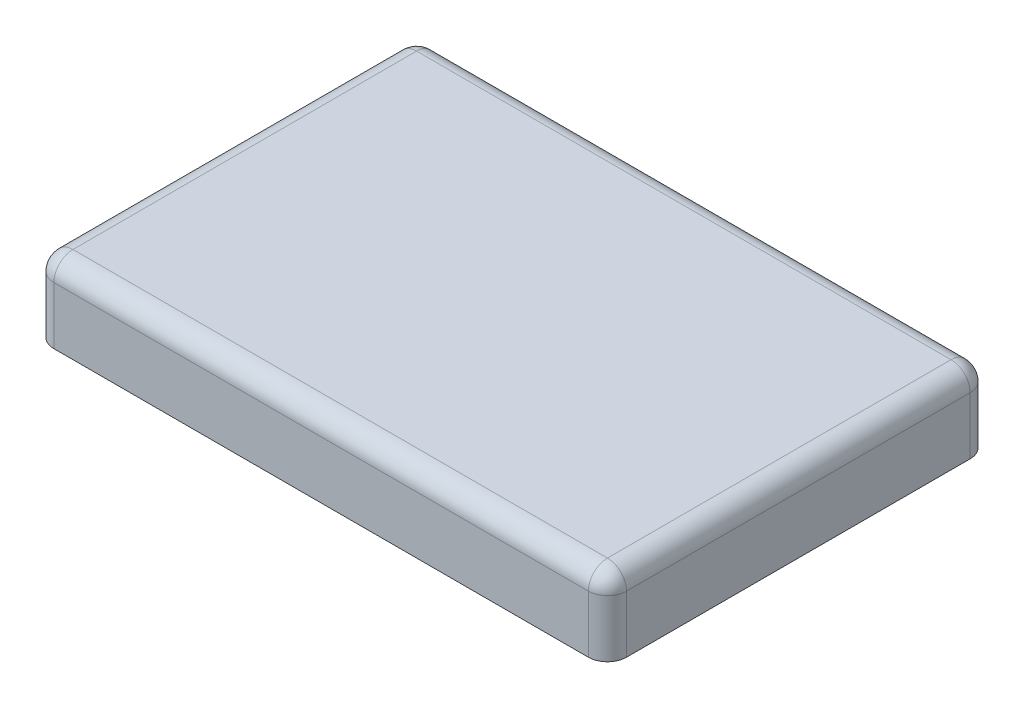
ISO-10303-21;
HEADER;
FILE_DESCRIPTION(('STEP AP214'),'2;1');
FILE_NAME('part.step','',(''),(''),'','','');
FILE_SCHEMA(('AUTOMOTIVE_DESIGN { 1 0 10303 214 1 1 1 1 }'));
ENDSEC;
DATA;
#1=APPLICATION_CONTEXT('core data for automotive mechanical design processes');
#2=APPLICATION_PROTOCOL_DEFINITION('international standard','automotive_design',2000,#1);
#3=PRODUCT_CONTEXT('',#1,'mechanical');
#4=PRODUCT('Part','Part','',(#3));
#5=PRODUCT_RELATED_PRODUCT_CATEGORY('part','',(#4));
#6=PRODUCT_DEFINITION_FORMATION('','',#4);
#7=PRODUCT_DEFINITION_CONTEXT('part definition',#1,'design');
#8=PRODUCT_DEFINITION('design','',#6,#7);
#9=PRODUCT_DEFINITION_SHAPE('','',#8);
#10=(LENGTH_UNIT() NAMED_UNIT(*) SI_UNIT(.MILLI.,.METRE.));
#11=(NAMED_UNIT(*) PLANE_ANGLE_UNIT() SI_UNIT($,.RADIAN.));
#12=(NAMED_UNIT(*) SI_UNIT($,.STERADIAN.) SOLID_ANGLE_UNIT());
#13=UNCERTAINTY_MEASURE_WITH_UNIT(LENGTH_MEASURE(1.E-05),#10,'distance_accuracy_value','');
#14=(GEOMETRIC_REPRESENTATION_CONTEXT(3) GLOBAL_UNCERTAINTY_ASSIGNED_CONTEXT((#13)) GLOBAL_UNIT_ASSIGNED_CONTEXT((#10,
#11,#12)) REPRESENTATION_CONTEXT('',''));
#15=CARTESIAN_POINT('',(0.,0.,0.));
#16=DIRECTION('',(0.,0.,1.));
#17=DIRECTION('',(1.,0.,0.));
#18=AXIS2_PLACEMENT_3D('',#15,#16,#17);
#19=CARTESIAN_POINT('',(0.,0.,0.));
#20=DIRECTION('',(0.,-1.,0.));
#21=DIRECTION('',(0.,0.,-1.));
#22=AXIS2_PLACEMENT_3D('',#19,#20,#21);
#23=PLANE('',#22);
#24=DIRECTION('',(0.,0.,1.));
#25=VECTOR('',#24,1.);
#26=CARTESIAN_POINT('',(-95.25,0.,63.5));
#27=LINE('',#26,#25);
#28=CARTESIAN_POINT('',(-95.25,0.,-57.15));
#29=VERTEX_POINT('',#28);
#30=CARTESIAN_POINT('',(-95.25,0.,57.15));
#31=VERTEX_POINT('',#30);
#32=EDGE_CURVE('E285',#29,#31,#27,.T.);
#33=ORIENTED_EDGE('',*,*,#32,.F.);
#34=CARTESIAN_POINT('',(-88.9,0.,-57.15));
#35=DIRECTION('',(0.,-1.,0.));
#36=DIRECTION('',(0.,0.,-1.));
#37=AXIS2_PLACEMENT_3D('',#34,#35,#36);
#38=CIRCLE('',#37,6.35);
#39=CARTESIAN_POINT('',(-88.9,0.,-63.5));
#40=VERTEX_POINT('',#39);
#41=EDGE_CURVE('E11',#29,#40,#38,.T.);
#42=ORIENTED_EDGE('',*,*,#41,.T.);
#43=DIRECTION('',(-1.,0.,0.));
#44=VECTOR('',#43,1.);
#45=CARTESIAN_POINT('',(-95.25,0.,-63.5));
#46=LINE('',#45,#44);
#47=CARTESIAN_POINT('',(88.9,0.,-63.5));
#48=VERTEX_POINT('',#47);
#49=EDGE_CURVE('E282',#48,#40,#46,.T.);
#50=ORIENTED_EDGE('',*,*,#49,.F.);
#51=CARTESIAN_POINT('',(88.9,0.,-57.15));
#52=DIRECTION('',(0.,-1.,0.));
#53=DIRECTION('',(0.,0.,-1.));
#54=AXIS2_PLACEMENT_3D('',#51,#52,#53);
#55=CIRCLE('',#54,6.35);
#56=CARTESIAN_POINT('',(95.25,0.,-57.15));
#57=VERTEX_POINT('',#56);
#58=EDGE_CURVE('E44',#48,#57,#55,.T.);
#59=ORIENTED_EDGE('',*,*,#58,.T.);
#60=DIRECTION('',(0.,0.,-1.));
#61=VECTOR('',#60,1.);
#62=CARTESIAN_POINT('',(95.25,0.,63.5));
#63=LINE('',#62,#61);
#64=CARTESIAN_POINT('',(95.25,0.,57.15));
#65=VERTEX_POINT('',#64);
#66=EDGE_CURVE('E280',#65,#57,#63,.T.);
#67=ORIENTED_EDGE('',*,*,#66,.F.);
#68=CARTESIAN_POINT('',(88.9,0.,57.15));
#69=DIRECTION('',(0.,-1.,0.));
#70=DIRECTION('',(0.,0.,-1.));
#71=AXIS2_PLACEMENT_3D('',#68,#69,#70);
#72=CIRCLE('',#71,6.35);
#73=CARTESIAN_POINT('',(88.9,0.,63.5));
#74=VERTEX_POINT('',#73);
#75=EDGE_CURVE('E324',#65,#74,#72,.T.);
#76=ORIENTED_EDGE('',*,*,#75,.T.);
#77=DIRECTION('',(1.,0.,0.));
#78=VECTOR('',#77,1.);
#79=CARTESIAN_POINT('',(-95.25,0.,63.5));
#80=LINE('',#79,#78);
#81=CARTESIAN_POINT('',(-88.9,0.,63.5));
#82=VERTEX_POINT('',#81);
#83=EDGE_CURVE('E288',#82,#74,#80,.T.);
#84=ORIENTED_EDGE('',*,*,#83,.F.);
#85=CARTESIAN_POINT('',(-88.9,0.,57.15));
#86=DIRECTION('',(0.,-1.,0.));
#87=DIRECTION('',(0.,0.,-1.));
#88=AXIS2_PLACEMENT_3D('',#85,#86,#87);
#89=CIRCLE('',#88,6.35);
#90=EDGE_CURVE('E326',#82,#31,#89,.T.);
#91=ORIENTED_EDGE('',*,*,#90,.T.);
#92=EDGE_LOOP('',(#33,#42,#50,#59,#67,#76,#84,#91));
#93=FACE_BOUND('',#92,.T.);
#94=CARTESIAN_POINT('',(-88.9,0.,-57.15));
#95=DIRECTION('',(0.,-1.,0.));
#96=DIRECTION('',(0.,0.,-1.));
#97=AXIS2_PLACEMENT_3D('',#94,#95,#96);
#98=CIRCLE('',#97,3.81);
#99=CARTESIAN_POINT('',(-92.71,0.,-57.15));
#100=VERTEX_POINT('',#99);
#101=CARTESIAN_POINT('',(-88.9,0.,-60.96));
#102=VERTEX_POINT('',#101);
#103=EDGE_CURVE('E274',#100,#102,#98,.T.);
#104=ORIENTED_EDGE('',*,*,#103,.F.);
#105=DIRECTION('',(0.,0.,1.));
#106=VECTOR('',#105,1.);
#107=CARTESIAN_POINT('',(-92.71,0.,0.));
#108=LINE('',#107,#106);
#109=CARTESIAN_POINT('',(-92.71,0.,57.15));
#110=VERTEX_POINT('',#109);
#111=EDGE_CURVE('E270',#100,#110,#108,.T.);
#112=ORIENTED_EDGE('',*,*,#111,.T.);
#113=CARTESIAN_POINT('',(-88.9,0.,57.15));
#114=DIRECTION('',(0.,-1.,0.));
#115=DIRECTION('',(0.,0.,-1.));
#116=AXIS2_PLACEMENT_3D('',#113,#114,#115);
#117=CIRCLE('',#116,3.81);
#118=CARTESIAN_POINT('',(-88.9,0.,60.96));
#119=VERTEX_POINT('',#118);
#120=EDGE_CURVE('E268',#119,#110,#117,.T.);
#121=ORIENTED_EDGE('',*,*,#120,.F.);
#122=DIRECTION('',(1.,0.,0.));
#123=VECTOR('',#122,1.);
#124=CARTESIAN_POINT('',(0.,0.,60.96));
#125=LINE('',#124,#123);
#126=CARTESIAN_POINT('',(88.9,0.,60.96));
#127=VERTEX_POINT('',#126);
#128=EDGE_CURVE('E52',#119,#127,#125,.T.);
#129=ORIENTED_EDGE('',*,*,#128,.T.);
#130=CARTESIAN_POINT('',(88.9,0.,57.15));
#131=DIRECTION('',(0.,-1.,0.));
#132=DIRECTION('',(0.,0.,-1.));
#133=AXIS2_PLACEMENT_3D('',#130,#131,#132);
#134=CIRCLE('',#133,3.81);
#135=CARTESIAN_POINT('',(92.71,0.,57.15));
#136=VERTEX_POINT('',#135);
#137=EDGE_CURVE('E186',#136,#127,#134,.T.);
#138=ORIENTED_EDGE('',*,*,#137,.F.);
#139=DIRECTION('',(0.,0.,-1.));
#140=VECTOR('',#139,1.);
#141=CARTESIAN_POINT('',(92.71,0.,0.));
#142=LINE('',#141,#140);
#143=CARTESIAN_POINT('',(92.71,0.,-57.15));
#144=VERTEX_POINT('',#143);
#145=EDGE_CURVE('E226',#136,#144,#142,.T.);
#146=ORIENTED_EDGE('',*,*,#145,.T.);
#147=CARTESIAN_POINT('',(88.9,0.,-57.15));
#148=DIRECTION('',(0.,-1.,0.));
#149=DIRECTION('',(0.,0.,-1.));
#150=AXIS2_PLACEMENT_3D('',#147,#148,#149);
#151=CIRCLE('',#150,3.81);
#152=CARTESIAN_POINT('',(88.9,0.,-60.96));
#153=VERTEX_POINT('',#152);
#154=EDGE_CURVE('E181',#153,#144,#151,.T.);
#155=ORIENTED_EDGE('',*,*,#154,.F.);
#156=DIRECTION('',(-1.,0.,0.));
#157=VECTOR('',#156,1.);
#158=CARTESIAN_POINT('',(0.,0.,-60.96));
#159=LINE('',#158,#157);
#160=EDGE_CURVE('E266',#153,#102,#159,.T.);
#161=ORIENTED_EDGE('',*,*,#160,.T.);
#162=EDGE_LOOP('',(#104,#112,#121,#129,#138,#146,#155,#161));
#163=FACE_BOUND('',#162,.T.);
#164=ADVANCED_FACE('F35',(#93,#163),#23,.T.);
#165=CARTESIAN_POINT('',(95.25,25.4,63.5));
#166=DIRECTION('',(-1.,0.,0.));
#167=DIRECTION('',(0.,0.,1.));
#168=AXIS2_PLACEMENT_3D('',#165,#166,#167);
#169=PLANE('',#168);
#170=ORIENTED_EDGE('',*,*,#66,.T.);
#171=DIRECTION('',(0.,-1.,0.));
#172=VECTOR('',#171,1.);
#173=CARTESIAN_POINT('',(95.25,25.4,-57.15));
#174=LINE('',#173,#172);
#175=CARTESIAN_POINT('',(95.25,19.05,-57.15));
#176=VERTEX_POINT('',#175);
#177=EDGE_CURVE('E60',#57,#176,#174,.F.);
#178=ORIENTED_EDGE('',*,*,#177,.T.);
#179=DIRECTION('',(0.,0.,-1.));
#180=VECTOR('',#179,1.);
#181=CARTESIAN_POINT('',(95.25,19.05,63.5));
#182=LINE('',#181,#180);
#183=CARTESIAN_POINT('',(95.25,19.05,57.15));
#184=VERTEX_POINT('',#183);
#185=EDGE_CURVE('E321',#176,#184,#182,.F.);
#186=ORIENTED_EDGE('',*,*,#185,.T.);
#187=DIRECTION('',(0.,-1.,0.));
#188=VECTOR('',#187,1.);
#189=CARTESIAN_POINT('',(95.25,25.4,57.15));
#190=LINE('',#189,#188);
#191=EDGE_CURVE('E319',#184,#65,#190,.T.);
#192=ORIENTED_EDGE('',*,*,#191,.T.);
#193=EDGE_LOOP('',(#170,#178,#186,#192));
#194=FACE_BOUND('',#193,.T.);
#195=ADVANCED_FACE('F395',(#194),#169,.F.);
#196=CARTESIAN_POINT('',(-95.25,25.4,-63.5));
#197=DIRECTION('',(0.,0.,1.));
#198=DIRECTION('',(1.,0.,0.));
#199=AXIS2_PLACEMENT_3D('',#196,#197,#198);
#200=PLANE('',#199);
#201=ORIENTED_EDGE('',*,*,#49,.T.);
#202=DIRECTION('',(0.,-1.,0.));
#203=VECTOR('',#202,1.);
#204=CARTESIAN_POINT('',(-88.9,25.4,-63.5));
#205=LINE('',#204,#203);
#206=CARTESIAN_POINT('',(-88.9,19.05,-63.5));
#207=VERTEX_POINT('',#206);
#208=EDGE_CURVE('E317',#40,#207,#205,.F.);
#209=ORIENTED_EDGE('',*,*,#208,.T.);
#210=DIRECTION('',(-1.,0.,0.));
#211=VECTOR('',#210,1.);
#212=CARTESIAN_POINT('',(-95.25,19.05,-63.5));
#213=LINE('',#212,#211);
#214=CARTESIAN_POINT('',(88.9,19.05,-63.5));
#215=VERTEX_POINT('',#214);
#216=EDGE_CURVE('E315',#207,#215,#213,.F.);
#217=ORIENTED_EDGE('',*,*,#216,.T.);
#218=DIRECTION('',(0.,-1.,0.));
#219=VECTOR('',#218,1.);
#220=CARTESIAN_POINT('',(88.9,25.4,-63.5));
#221=LINE('',#220,#219);
#222=EDGE_CURVE('E313',#215,#48,#221,.T.);
#223=ORIENTED_EDGE('',*,*,#222,.T.);
#224=EDGE_LOOP('',(#201,#209,#217,#223));
#225=FACE_BOUND('',#224,.T.);
#226=ADVANCED_FACE('F384',(#225),#200,.F.);
#227=CARTESIAN_POINT('',(-95.25,25.4,63.5));
#228=DIRECTION('',(1.,0.,0.));
#229=DIRECTION('',(0.,0.,-1.));
#230=AXIS2_PLACEMENT_3D('',#227,#228,#229);
#231=PLANE('',#230);
#232=DIRECTION('',(0.,0.,1.));
#233=VECTOR('',#232,1.);
#234=CARTESIAN_POINT('',(-95.25,19.05,63.5));
#235=LINE('',#234,#233);
#236=CARTESIAN_POINT('',(-95.25,19.05,57.15));
#237=VERTEX_POINT('',#236);
#238=CARTESIAN_POINT('',(-95.25,19.05,-57.15));
#239=VERTEX_POINT('',#238);
#240=EDGE_CURVE('E309',#237,#239,#235,.F.);
#241=ORIENTED_EDGE('',*,*,#240,.T.);
#242=DIRECTION('',(0.,-1.,0.));
#243=VECTOR('',#242,1.);
#244=CARTESIAN_POINT('',(-95.25,25.4,-57.15));
#245=LINE('',#244,#243);
#246=EDGE_CURVE('E311',#239,#29,#245,.T.);
#247=ORIENTED_EDGE('',*,*,#246,.T.);
#248=ORIENTED_EDGE('',*,*,#32,.T.);
#249=DIRECTION('',(0.,-1.,0.));
#250=VECTOR('',#249,1.);
#251=CARTESIAN_POINT('',(-95.25,25.4,57.15));
#252=LINE('',#251,#250);
#253=EDGE_CURVE('E307',#31,#237,#252,.F.);
#254=ORIENTED_EDGE('',*,*,#253,.T.);
#255=EDGE_LOOP('',(#241,#247,#248,#254));
#256=FACE_BOUND('',#255,.T.);
#257=ADVANCED_FACE('F420',(#256),#231,.F.);
#258=CARTESIAN_POINT('',(-95.25,25.4,63.5));
#259=DIRECTION('',(0.,0.,-1.));
#260=DIRECTION('',(-1.,0.,0.));
#261=AXIS2_PLACEMENT_3D('',#258,#259,#260);
#262=PLANE('',#261);
#263=DIRECTION('',(1.,0.,0.));
#264=VECTOR('',#263,1.);
#265=CARTESIAN_POINT('',(-95.25,19.05,63.5));
#266=LINE('',#265,#264);
#267=CARTESIAN_POINT('',(88.9,19.05,63.5));
#268=VERTEX_POINT('',#267);
#269=CARTESIAN_POINT('',(-88.9,19.05,63.5));
#270=VERTEX_POINT('',#269);
#271=EDGE_CURVE('E302',#268,#270,#266,.F.);
#272=ORIENTED_EDGE('',*,*,#271,.T.);
#273=DIRECTION('',(0.,-1.,0.));
#274=VECTOR('',#273,1.);
#275=CARTESIAN_POINT('',(-88.9,25.4,63.5));
#276=LINE('',#275,#274);
#277=EDGE_CURVE('E305',#270,#82,#276,.T.);
#278=ORIENTED_EDGE('',*,*,#277,.T.);
#279=ORIENTED_EDGE('',*,*,#83,.T.);
#280=DIRECTION('',(0.,-1.,0.));
#281=VECTOR('',#280,1.);
#282=CARTESIAN_POINT('',(88.9,25.4,63.5));
#283=LINE('',#282,#281);
#284=EDGE_CURVE('E300',#74,#268,#283,.F.);
#285=ORIENTED_EDGE('',*,*,#284,.T.);
#286=EDGE_LOOP('',(#272,#278,#279,#285));
#287=FACE_BOUND('',#286,.T.);
#288=ADVANCED_FACE('F412',(#287),#262,.F.);
#289=CARTESIAN_POINT('',(0.,25.4,0.));
#290=DIRECTION('',(0.,-1.,0.));
#291=DIRECTION('',(0.,0.,-1.));
#292=AXIS2_PLACEMENT_3D('',#289,#290,#291);
#293=PLANE('',#292);
#294=DIRECTION('',(0.,0.,1.));
#295=VECTOR('',#294,1.);
#296=CARTESIAN_POINT('',(-88.9,25.4,0.));
#297=LINE('',#296,#295);
#298=CARTESIAN_POINT('',(-88.9,25.4,-57.15));
#299=VERTEX_POINT('',#298);
#300=CARTESIAN_POINT('',(-88.9,25.4,57.15));
#301=VERTEX_POINT('',#300);
#302=EDGE_CURVE('E295',#299,#301,#297,.T.);
#303=ORIENTED_EDGE('',*,*,#302,.T.);
#304=DIRECTION('',(1.,0.,0.));
#305=VECTOR('',#304,1.);
#306=CARTESIAN_POINT('',(0.,25.4,57.15));
#307=LINE('',#306,#305);
#308=CARTESIAN_POINT('',(88.9,25.4,57.15));
#309=VERTEX_POINT('',#308);
#310=EDGE_CURVE('E297',#301,#309,#307,.T.);
#311=ORIENTED_EDGE('',*,*,#310,.T.);
#312=DIRECTION('',(0.,0.,-1.));
#313=VECTOR('',#312,1.);
#314=CARTESIAN_POINT('',(88.9,25.4,0.));
#315=LINE('',#314,#313);
#316=CARTESIAN_POINT('',(88.9,25.4,-57.15));
#317=VERTEX_POINT('',#316);
#318=EDGE_CURVE('E291',#309,#317,#315,.T.);
#319=ORIENTED_EDGE('',*,*,#318,.T.);
#320=DIRECTION('',(-1.,0.,0.));
#321=VECTOR('',#320,1.);
#322=CARTESIAN_POINT('',(0.,25.4,-57.15));
#323=LINE('',#322,#321);
#324=EDGE_CURVE('E293',#317,#299,#323,.T.);
#325=ORIENTED_EDGE('',*,*,#324,.T.);
#326=EDGE_LOOP('',(#303,#311,#319,#325));
#327=FACE_BOUND('',#326,.T.);
#328=ADVANCED_FACE('F374',(#327),#293,.F.);
#329=CARTESIAN_POINT('',(-88.9,25.4,-57.15));
#330=DIRECTION('',(0.,-1.,0.));
#331=DIRECTION('',(0.,0.,-1.));
#332=AXIS2_PLACEMENT_3D('',#329,#330,#331);
#333=CYLINDRICAL_SURFACE('',#332,6.35);
#334=ORIENTED_EDGE('',*,*,#41,.F.);
#335=ORIENTED_EDGE('',*,*,#246,.F.);
#336=CARTESIAN_POINT('',(-88.9,19.05,-57.15));
#337=DIRECTION('',(0.,1.,0.));
#338=DIRECTION('',(0.,0.,1.));
#339=AXIS2_PLACEMENT_3D('',#336,#337,#338);
#340=CIRCLE('',#339,6.35);
#341=EDGE_CURVE('E39',#207,#239,#340,.T.);
#342=ORIENTED_EDGE('',*,*,#341,.F.);
#343=ORIENTED_EDGE('',*,*,#208,.F.);
#344=EDGE_LOOP('',(#334,#335,#342,#343));
#345=FACE_BOUND('',#344,.T.);
#346=ADVANCED_FACE('F37',(#345),#333,.T.);
#347=CARTESIAN_POINT('',(0.,19.05,-57.15));
#348=DIRECTION('',(-1.,0.,0.));
#349=DIRECTION('',(0.,0.,1.));
#350=AXIS2_PLACEMENT_3D('',#347,#348,#349);
#351=CYLINDRICAL_SURFACE('',#350,6.35);
#352=CARTESIAN_POINT('',(88.9,19.05,-57.15));
#353=DIRECTION('',(1.,0.,0.));
#354=DIRECTION('',(0.,0.,-1.));
#355=AXIS2_PLACEMENT_3D('',#352,#353,#354);
#356=CIRCLE('',#355,6.35);
#357=EDGE_CURVE('E353',#215,#317,#356,.T.);
#358=ORIENTED_EDGE('',*,*,#357,.F.);
#359=ORIENTED_EDGE('',*,*,#216,.F.);
#360=CARTESIAN_POINT('',(-88.9,19.05,-57.15));
#361=DIRECTION('',(-1.,0.,0.));
#362=DIRECTION('',(0.,0.,1.));
#363=AXIS2_PLACEMENT_3D('',#360,#361,#362);
#364=CIRCLE('',#363,6.35);
#365=EDGE_CURVE('E355',#299,#207,#364,.T.);
#366=ORIENTED_EDGE('',*,*,#365,.F.);
#367=ORIENTED_EDGE('',*,*,#324,.F.);
#368=EDGE_LOOP('',(#358,#359,#366,#367));
#369=FACE_BOUND('',#368,.T.);
#370=ADVANCED_FACE('F381',(#369),#351,.T.);
#371=CARTESIAN_POINT('',(88.9,25.4,-57.15));
#372=DIRECTION('',(0.,-1.,0.));
#373=DIRECTION('',(0.,0.,-1.));
#374=AXIS2_PLACEMENT_3D('',#371,#372,#373);
#375=CYLINDRICAL_SURFACE('',#374,6.35);
#376=ORIENTED_EDGE('',*,*,#58,.F.);
#377=ORIENTED_EDGE('',*,*,#222,.F.);
#378=CARTESIAN_POINT('',(88.9,19.05,-57.15));
#379=DIRECTION('',(0.,1.,0.));
#380=DIRECTION('',(0.,0.,1.));
#381=AXIS2_PLACEMENT_3D('',#378,#379,#380);
#382=CIRCLE('',#381,6.35);
#383=EDGE_CURVE('E350',#176,#215,#382,.T.);
#384=ORIENTED_EDGE('',*,*,#383,.F.);
#385=ORIENTED_EDGE('',*,*,#177,.F.);
#386=EDGE_LOOP('',(#376,#377,#384,#385));
#387=FACE_BOUND('',#386,.T.);
#388=ADVANCED_FACE('F388',(#387),#375,.T.);
#389=CARTESIAN_POINT('',(-88.9,19.05,-57.15));
#390=DIRECTION('',(0.,0.,1.));
#391=DIRECTION('',(1.,0.,0.));
#392=AXIS2_PLACEMENT_3D('',#389,#390,#391);
#393=SPHERICAL_SURFACE('',#392,6.35);
#394=ORIENTED_EDGE('',*,*,#365,.T.);
#395=ORIENTED_EDGE('',*,*,#341,.T.);
#396=CARTESIAN_POINT('',(-88.9,19.05,-57.15));
#397=DIRECTION('',(0.,0.,-1.));
#398=DIRECTION('',(0.,1.,0.));
#399=AXIS2_PLACEMENT_3D('',#396,#397,#398);
#400=CIRCLE('',#399,6.35);
#401=EDGE_CURVE('E347',#299,#239,#400,.F.);
#402=ORIENTED_EDGE('',*,*,#401,.F.);
#403=EDGE_LOOP('',(#394,#395,#402));
#404=FACE_BOUND('',#403,.T.);
#405=ADVANCED_FACE('F362',(#404),#393,.T.);
#406=CARTESIAN_POINT('',(88.9,19.05,-57.15));
#407=DIRECTION('',(0.,0.,1.));
#408=DIRECTION('',(1.,0.,0.));
#409=AXIS2_PLACEMENT_3D('',#406,#407,#408);
#410=SPHERICAL_SURFACE('',#409,6.35);
#411=ORIENTED_EDGE('',*,*,#383,.T.);
#412=ORIENTED_EDGE('',*,*,#357,.T.);
#413=CARTESIAN_POINT('',(88.9,19.05,-57.15));
#414=DIRECTION('',(0.,0.,-1.));
#415=DIRECTION('',(-1.,0.,0.));
#416=AXIS2_PLACEMENT_3D('',#413,#414,#415);
#417=CIRCLE('',#416,6.35);
#418=EDGE_CURVE('E344',#176,#317,#417,.F.);
#419=ORIENTED_EDGE('',*,*,#418,.F.);
#420=EDGE_LOOP('',(#411,#412,#419));
#421=FACE_BOUND('',#420,.T.);
#422=ADVANCED_FACE('F458',(#421),#410,.T.);
#423=CARTESIAN_POINT('',(-88.9,25.4,57.15));
#424=DIRECTION('',(0.,-1.,0.));
#425=DIRECTION('',(0.,0.,-1.));
#426=AXIS2_PLACEMENT_3D('',#423,#424,#425);
#427=CYLINDRICAL_SURFACE('',#426,6.35);
#428=ORIENTED_EDGE('',*,*,#90,.F.);
#429=ORIENTED_EDGE('',*,*,#277,.F.);
#430=CARTESIAN_POINT('',(-88.9,19.05,57.15));
#431=DIRECTION('',(0.,1.,0.));
#432=DIRECTION('',(0.,0.,1.));
#433=AXIS2_PLACEMENT_3D('',#430,#431,#432);
#434=CIRCLE('',#433,6.35);
#435=EDGE_CURVE('E341',#237,#270,#434,.T.);
#436=ORIENTED_EDGE('',*,*,#435,.F.);
#437=ORIENTED_EDGE('',*,*,#253,.F.);
#438=EDGE_LOOP('',(#428,#429,#436,#437));
#439=FACE_BOUND('',#438,.T.);
#440=ADVANCED_FACE('F418',(#439),#427,.T.);
#441=CARTESIAN_POINT('',(-88.9,19.05,0.));
#442=DIRECTION('',(0.,0.,1.));
#443=DIRECTION('',(1.,0.,0.));
#444=AXIS2_PLACEMENT_3D('',#441,#442,#443);
#445=CYLINDRICAL_SURFACE('',#444,6.35);
#446=ORIENTED_EDGE('',*,*,#401,.T.);
#447=ORIENTED_EDGE('',*,*,#240,.F.);
#448=CARTESIAN_POINT('',(-88.9,19.05,57.15));
#449=DIRECTION('',(0.,0.,1.));
#450=DIRECTION('',(1.,0.,0.));
#451=AXIS2_PLACEMENT_3D('',#448,#449,#450);
#452=CIRCLE('',#451,6.35);
#453=EDGE_CURVE('E338',#301,#237,#452,.T.);
#454=ORIENTED_EDGE('',*,*,#453,.F.);
#455=ORIENTED_EDGE('',*,*,#302,.F.);
#456=EDGE_LOOP('',(#446,#447,#454,#455));
#457=FACE_BOUND('',#456,.T.);
#458=ADVANCED_FACE('F369',(#457),#445,.T.);
#459=CARTESIAN_POINT('',(88.9,19.05,0.));
#460=DIRECTION('',(0.,0.,-1.));
#461=DIRECTION('',(-1.,0.,0.));
#462=AXIS2_PLACEMENT_3D('',#459,#460,#461);
#463=CYLINDRICAL_SURFACE('',#462,6.35);
#464=ORIENTED_EDGE('',*,*,#418,.T.);
#465=ORIENTED_EDGE('',*,*,#318,.F.);
#466=CARTESIAN_POINT('',(88.9,19.05,57.15));
#467=DIRECTION('',(0.,0.,1.));
#468=DIRECTION('',(1.,0.,0.));
#469=AXIS2_PLACEMENT_3D('',#466,#467,#468);
#470=CIRCLE('',#469,6.35);
#471=EDGE_CURVE('E335',#184,#309,#470,.T.);
#472=ORIENTED_EDGE('',*,*,#471,.F.);
#473=ORIENTED_EDGE('',*,*,#185,.F.);
#474=EDGE_LOOP('',(#464,#465,#472,#473));
#475=FACE_BOUND('',#474,.T.);
#476=ADVANCED_FACE('F405',(#475),#463,.T.);
#477=CARTESIAN_POINT('',(88.9,25.4,57.15));
#478=DIRECTION('',(0.,-1.,0.));
#479=DIRECTION('',(0.,0.,-1.));
#480=AXIS2_PLACEMENT_3D('',#477,#478,#479);
#481=CYLINDRICAL_SURFACE('',#480,6.35);
#482=ORIENTED_EDGE('',*,*,#75,.F.);
#483=ORIENTED_EDGE('',*,*,#191,.F.);
#484=CARTESIAN_POINT('',(88.9,19.05,57.15));
#485=DIRECTION('',(0.,1.,0.));
#486=DIRECTION('',(0.,0.,1.));
#487=AXIS2_PLACEMENT_3D('',#484,#485,#486);
#488=CIRCLE('',#487,6.35);
#489=EDGE_CURVE('E332',#268,#184,#488,.T.);
#490=ORIENTED_EDGE('',*,*,#489,.F.);
#491=ORIENTED_EDGE('',*,*,#284,.F.);
#492=EDGE_LOOP('',(#482,#483,#490,#491));
#493=FACE_BOUND('',#492,.T.);
#494=ADVANCED_FACE('F401',(#493),#481,.T.);
#495=CARTESIAN_POINT('',(-88.9,19.05,57.15));
#496=DIRECTION('',(0.,0.,1.));
#497=DIRECTION('',(1.,0.,0.));
#498=AXIS2_PLACEMENT_3D('',#495,#496,#497);
#499=SPHERICAL_SURFACE('',#498,6.35);
#500=ORIENTED_EDGE('',*,*,#453,.T.);
#501=ORIENTED_EDGE('',*,*,#435,.T.);
#502=CARTESIAN_POINT('',(-88.9,19.05,57.15));
#503=DIRECTION('',(-1.,0.,0.));
#504=DIRECTION('',(0.,0.,1.));
#505=AXIS2_PLACEMENT_3D('',#502,#503,#504);
#506=CIRCLE('',#505,6.35);
#507=EDGE_CURVE('E330',#301,#270,#506,.F.);
#508=ORIENTED_EDGE('',*,*,#507,.F.);
#509=EDGE_LOOP('',(#500,#501,#508));
#510=FACE_BOUND('',#509,.T.);
#511=ADVANCED_FACE('F446',(#510),#499,.T.);
#512=CARTESIAN_POINT('',(88.9,19.05,57.15));
#513=DIRECTION('',(0.,0.,1.));
#514=DIRECTION('',(1.,0.,0.));
#515=AXIS2_PLACEMENT_3D('',#512,#513,#514);
#516=SPHERICAL_SURFACE('',#515,6.35);
#517=ORIENTED_EDGE('',*,*,#489,.T.);
#518=ORIENTED_EDGE('',*,*,#471,.T.);
#519=CARTESIAN_POINT('',(88.9,19.05,57.15));
#520=DIRECTION('',(1.,0.,0.));
#521=DIRECTION('',(0.,0.,-1.));
#522=AXIS2_PLACEMENT_3D('',#519,#520,#521);
#523=CIRCLE('',#522,6.35);
#524=EDGE_CURVE('E276',#268,#309,#523,.F.);
#525=ORIENTED_EDGE('',*,*,#524,.F.);
#526=EDGE_LOOP('',(#517,#518,#525));
#527=FACE_BOUND('',#526,.T.);
#528=ADVANCED_FACE('F408',(#527),#516,.T.);
#529=CARTESIAN_POINT('',(0.,19.05,57.15));
#530=DIRECTION('',(1.,0.,0.));
#531=DIRECTION('',(0.,0.,-1.));
#532=AXIS2_PLACEMENT_3D('',#529,#530,#531);
#533=CYLINDRICAL_SURFACE('',#532,6.35);
#534=ORIENTED_EDGE('',*,*,#507,.T.);
#535=ORIENTED_EDGE('',*,*,#271,.F.);
#536=ORIENTED_EDGE('',*,*,#524,.T.);
#537=ORIENTED_EDGE('',*,*,#310,.F.);
#538=EDGE_LOOP('',(#534,#535,#536,#537));
#539=FACE_BOUND('',#538,.T.);
#540=ADVANCED_FACE('F410',(#539),#533,.T.);
#541=CARTESIAN_POINT('',(92.71,25.4,63.5));
#542=DIRECTION('',(-1.,0.,0.));
#543=DIRECTION('',(0.,0.,1.));
#544=AXIS2_PLACEMENT_3D('',#541,#542,#543);
#545=PLANE('',#544);
#546=ORIENTED_EDGE('',*,*,#145,.F.);
#547=DIRECTION('',(0.,1.,0.));
#548=VECTOR('',#547,1.);
#549=CARTESIAN_POINT('',(92.71,25.4,57.15));
#550=LINE('',#549,#548);
#551=CARTESIAN_POINT('',(92.71,19.05,57.15));
#552=VERTEX_POINT('',#551);
#553=EDGE_CURVE('E209',#552,#136,#550,.F.);
#554=ORIENTED_EDGE('',*,*,#553,.F.);
#555=DIRECTION('',(0.,0.,1.));
#556=VECTOR('',#555,1.);
#557=CARTESIAN_POINT('',(92.71,19.05,63.5));
#558=LINE('',#557,#556);
#559=CARTESIAN_POINT('',(92.71,19.05,-57.15));
#560=VERTEX_POINT('',#559);
#561=EDGE_CURVE('E187',#560,#552,#558,.T.);
#562=ORIENTED_EDGE('',*,*,#561,.F.);
#563=DIRECTION('',(0.,1.,0.));
#564=VECTOR('',#563,1.);
#565=CARTESIAN_POINT('',(92.71,25.4,-57.15));
#566=LINE('',#565,#564);
#567=EDGE_CURVE('E176',#144,#560,#566,.T.);
#568=ORIENTED_EDGE('',*,*,#567,.F.);
#569=EDGE_LOOP('',(#546,#554,#562,#568));
#570=FACE_BOUND('',#569,.T.);
#571=ADVANCED_FACE('F208',(#570),#545,.T.);
#572=CARTESIAN_POINT('',(-95.25,25.4,-60.96));
#573=DIRECTION('',(0.,0.,1.));
#574=DIRECTION('',(1.,0.,0.));
#575=AXIS2_PLACEMENT_3D('',#572,#573,#574);
#576=PLANE('',#575);
#577=ORIENTED_EDGE('',*,*,#160,.F.);
#578=DIRECTION('',(0.,1.,0.));
#579=VECTOR('',#578,1.);
#580=CARTESIAN_POINT('',(88.9,25.4,-60.96));
#581=LINE('',#580,#579);
#582=CARTESIAN_POINT('',(88.9,19.05,-60.96));
#583=VERTEX_POINT('',#582);
#584=EDGE_CURVE('E215',#583,#153,#581,.F.);
#585=ORIENTED_EDGE('',*,*,#584,.F.);
#586=DIRECTION('',(1.,0.,0.));
#587=VECTOR('',#586,1.);
#588=CARTESIAN_POINT('',(-95.25,19.05,-60.96));
#589=LINE('',#588,#587);
#590=CARTESIAN_POINT('',(-88.9,19.05,-60.96));
#591=VERTEX_POINT('',#590);
#592=EDGE_CURVE('E216',#591,#583,#589,.T.);
#593=ORIENTED_EDGE('',*,*,#592,.F.);
#594=DIRECTION('',(0.,1.,0.));
#595=VECTOR('',#594,1.);
#596=CARTESIAN_POINT('',(-88.9,25.4,-60.96));
#597=LINE('',#596,#595);
#598=EDGE_CURVE('E212',#102,#591,#597,.T.);
#599=ORIENTED_EDGE('',*,*,#598,.F.);
#600=EDGE_LOOP('',(#577,#585,#593,#599));
#601=FACE_BOUND('',#600,.T.);
#602=ADVANCED_FACE('F511',(#601),#576,.T.);
#603=CARTESIAN_POINT('',(-92.71,25.4,63.5));
#604=DIRECTION('',(1.,0.,0.));
#605=DIRECTION('',(0.,0.,-1.));
#606=AXIS2_PLACEMENT_3D('',#603,#604,#605);
#607=PLANE('',#606);
#608=DIRECTION('',(0.,0.,-1.));
#609=VECTOR('',#608,1.);
#610=CARTESIAN_POINT('',(-92.71,19.05,63.5));
#611=LINE('',#610,#609);
#612=CARTESIAN_POINT('',(-92.71,19.05,57.15));
#613=VERTEX_POINT('',#612);
#614=CARTESIAN_POINT('',(-92.71,19.05,-57.15));
#615=VERTEX_POINT('',#614);
#616=EDGE_CURVE('E222',#613,#615,#611,.T.);
#617=ORIENTED_EDGE('',*,*,#616,.F.);
#618=DIRECTION('',(0.,1.,0.));
#619=VECTOR('',#618,1.);
#620=CARTESIAN_POINT('',(-92.71,25.4,57.15));
#621=LINE('',#620,#619);
#622=EDGE_CURVE('E229',#110,#613,#621,.T.);
#623=ORIENTED_EDGE('',*,*,#622,.F.);
#624=ORIENTED_EDGE('',*,*,#111,.F.);
#625=DIRECTION('',(0.,1.,0.));
#626=VECTOR('',#625,1.);
#627=CARTESIAN_POINT('',(-92.71,25.4,-57.15));
#628=LINE('',#627,#626);
#629=EDGE_CURVE('E217',#615,#100,#628,.F.);
#630=ORIENTED_EDGE('',*,*,#629,.F.);
#631=EDGE_LOOP('',(#617,#623,#624,#630));
#632=FACE_BOUND('',#631,.T.);
#633=ADVANCED_FACE('F518',(#632),#607,.T.);
#634=CARTESIAN_POINT('',(-95.25,25.4,60.96));
#635=DIRECTION('',(0.,0.,-1.));
#636=DIRECTION('',(-1.,0.,0.));
#637=AXIS2_PLACEMENT_3D('',#634,#635,#636);
#638=PLANE('',#637);
#639=DIRECTION('',(-1.,0.,0.));
#640=VECTOR('',#639,1.);
#641=CARTESIAN_POINT('',(-95.25,19.05,60.96));
#642=LINE('',#641,#640);
#643=CARTESIAN_POINT('',(88.9,19.05,60.96));
#644=VERTEX_POINT('',#643);
#645=CARTESIAN_POINT('',(-88.9,19.05,60.96));
#646=VERTEX_POINT('',#645);
#647=EDGE_CURVE('E254',#644,#646,#642,.T.);
#648=ORIENTED_EDGE('',*,*,#647,.F.);
#649=DIRECTION('',(0.,1.,0.));
#650=VECTOR('',#649,1.);
#651=CARTESIAN_POINT('',(88.9,25.4,60.96));
#652=LINE('',#651,#650);
#653=EDGE_CURVE('E242',#127,#644,#652,.T.);
#654=ORIENTED_EDGE('',*,*,#653,.F.);
#655=ORIENTED_EDGE('',*,*,#128,.F.);
#656=DIRECTION('',(0.,1.,0.));
#657=VECTOR('',#656,1.);
#658=CARTESIAN_POINT('',(-88.9,25.4,60.96));
#659=LINE('',#658,#657);
#660=EDGE_CURVE('E231',#646,#119,#659,.F.);
#661=ORIENTED_EDGE('',*,*,#660,.F.);
#662=EDGE_LOOP('',(#648,#654,#655,#661));
#663=FACE_BOUND('',#662,.T.);
#664=ADVANCED_FACE('F526',(#663),#638,.T.);
#665=CARTESIAN_POINT('',(0.,22.86,0.));
#666=DIRECTION('',(0.,-1.,0.));
#667=DIRECTION('',(0.,0.,-1.));
#668=AXIS2_PLACEMENT_3D('',#665,#666,#667);
#669=PLANE('',#668);
#670=DIRECTION('',(0.,0.,-1.));
#671=VECTOR('',#670,1.);
#672=CARTESIAN_POINT('',(-88.9,22.86,0.));
#673=LINE('',#672,#671);
#674=CARTESIAN_POINT('',(-88.9,22.86,-57.15));
#675=VERTEX_POINT('',#674);
#676=CARTESIAN_POINT('',(-88.9,22.86,57.15));
#677=VERTEX_POINT('',#676);
#678=EDGE_CURVE('E236',#675,#677,#673,.F.);
#679=ORIENTED_EDGE('',*,*,#678,.F.);
#680=DIRECTION('',(1.,0.,0.));
#681=VECTOR('',#680,1.);
#682=CARTESIAN_POINT('',(0.,22.86,-57.15));
#683=LINE('',#682,#681);
#684=CARTESIAN_POINT('',(88.9,22.86,-57.15));
#685=VERTEX_POINT('',#684);
#686=EDGE_CURVE('E239',#685,#675,#683,.F.);
#687=ORIENTED_EDGE('',*,*,#686,.F.);
#688=DIRECTION('',(0.,0.,-1.));
#689=VECTOR('',#688,1.);
#690=CARTESIAN_POINT('',(88.9,22.86,0.));
#691=LINE('',#690,#689);
#692=CARTESIAN_POINT('',(88.9,22.86,57.15));
#693=VERTEX_POINT('',#692);
#694=EDGE_CURVE('E204',#693,#685,#691,.T.);
#695=ORIENTED_EDGE('',*,*,#694,.F.);
#696=DIRECTION('',(1.,0.,0.));
#697=VECTOR('',#696,1.);
#698=CARTESIAN_POINT('',(0.,22.86,57.15));
#699=LINE('',#698,#697);
#700=EDGE_CURVE('E238',#677,#693,#699,.T.);
#701=ORIENTED_EDGE('',*,*,#700,.F.);
#702=EDGE_LOOP('',(#679,#687,#695,#701));
#703=FACE_BOUND('',#702,.T.);
#704=ADVANCED_FACE('F534',(#703),#669,.T.);
#705=CARTESIAN_POINT('',(-88.9,25.4,-57.15));
#706=DIRECTION('',(0.,-1.,0.));
#707=DIRECTION('',(0.,0.,-1.));
#708=AXIS2_PLACEMENT_3D('',#705,#706,#707);
#709=CYLINDRICAL_SURFACE('',#708,3.81);
#710=ORIENTED_EDGE('',*,*,#103,.T.);
#711=ORIENTED_EDGE('',*,*,#598,.T.);
#712=CARTESIAN_POINT('',(-88.9,19.05,-57.15));
#713=DIRECTION('',(0.,1.,0.));
#714=DIRECTION('',(-1.,0.,0.));
#715=AXIS2_PLACEMENT_3D('',#712,#713,#714);
#716=CIRCLE('',#715,3.81);
#717=EDGE_CURVE('E223',#591,#615,#716,.T.);
#718=ORIENTED_EDGE('',*,*,#717,.T.);
#719=ORIENTED_EDGE('',*,*,#629,.T.);
#720=EDGE_LOOP('',(#710,#711,#718,#719));
#721=FACE_BOUND('',#720,.T.);
#722=ADVANCED_FACE('F541',(#721),#709,.F.);
#723=CARTESIAN_POINT('',(0.,19.05,-57.15));
#724=DIRECTION('',(-1.,0.,0.));
#725=DIRECTION('',(0.,0.,1.));
#726=AXIS2_PLACEMENT_3D('',#723,#724,#725);
#727=CYLINDRICAL_SURFACE('',#726,3.81);
#728=CARTESIAN_POINT('',(88.9,19.05,-57.15));
#729=DIRECTION('',(1.,0.,0.));
#730=DIRECTION('',(0.,1.,0.));
#731=AXIS2_PLACEMENT_3D('',#728,#729,#730);
#732=CIRCLE('',#731,3.81);
#733=EDGE_CURVE('E196',#583,#685,#732,.T.);
#734=ORIENTED_EDGE('',*,*,#733,.T.);
#735=ORIENTED_EDGE('',*,*,#686,.T.);
#736=CARTESIAN_POINT('',(-88.9,19.05,-57.15));
#737=DIRECTION('',(1.,0.,0.));
#738=DIRECTION('',(0.,1.,0.));
#739=AXIS2_PLACEMENT_3D('',#736,#737,#738);
#740=CIRCLE('',#739,3.81);
#741=EDGE_CURVE('E227',#675,#591,#740,.F.);
#742=ORIENTED_EDGE('',*,*,#741,.T.);
#743=ORIENTED_EDGE('',*,*,#592,.T.);
#744=EDGE_LOOP('',(#734,#735,#742,#743));
#745=FACE_BOUND('',#744,.T.);
#746=ADVANCED_FACE('F549',(#745),#727,.F.);
#747=CARTESIAN_POINT('',(88.9,25.4,-57.15));
#748=DIRECTION('',(0.,-1.,0.));
#749=DIRECTION('',(0.,0.,-1.));
#750=AXIS2_PLACEMENT_3D('',#747,#748,#749);
#751=CYLINDRICAL_SURFACE('',#750,3.81);
#752=ORIENTED_EDGE('',*,*,#154,.T.);
#753=ORIENTED_EDGE('',*,*,#567,.T.);
#754=CARTESIAN_POINT('',(88.9,19.05,-57.15));
#755=DIRECTION('',(0.,-1.,0.));
#756=DIRECTION('',(0.,0.,-1.));
#757=AXIS2_PLACEMENT_3D('',#754,#755,#756);
#758=CIRCLE('',#757,3.81);
#759=EDGE_CURVE('E179',#560,#583,#758,.F.);
#760=ORIENTED_EDGE('',*,*,#759,.T.);
#761=ORIENTED_EDGE('',*,*,#584,.T.);
#762=EDGE_LOOP('',(#752,#753,#760,#761));
#763=FACE_BOUND('',#762,.T.);
#764=ADVANCED_FACE('F178',(#763),#751,.F.);
#765=CARTESIAN_POINT('',(-88.9,19.05,-57.15));
#766=DIRECTION('',(0.,0.,1.));
#767=DIRECTION('',(1.,0.,0.));
#768=AXIS2_PLACEMENT_3D('',#765,#766,#767);
#769=SPHERICAL_SURFACE('',#768,3.81);
#770=ORIENTED_EDGE('',*,*,#741,.F.);
#771=CARTESIAN_POINT('',(-88.9,19.05,-57.15));
#772=DIRECTION('',(0.,0.,1.));
#773=DIRECTION('',(1.,0.,0.));
#774=AXIS2_PLACEMENT_3D('',#771,#772,#773);
#775=CIRCLE('',#774,3.81);
#776=EDGE_CURVE('E197',#675,#615,#775,.T.);
#777=ORIENTED_EDGE('',*,*,#776,.T.);
#778=ORIENTED_EDGE('',*,*,#717,.F.);
#779=EDGE_LOOP('',(#770,#777,#778));
#780=FACE_BOUND('',#779,.T.);
#781=ADVANCED_FACE('F564',(#780),#769,.F.);
#782=CARTESIAN_POINT('',(88.9,19.05,-57.15));
#783=DIRECTION('',(0.,0.,1.));
#784=DIRECTION('',(1.,0.,0.));
#785=AXIS2_PLACEMENT_3D('',#782,#783,#784);
#786=SPHERICAL_SURFACE('',#785,3.81);
#787=ORIENTED_EDGE('',*,*,#759,.F.);
#788=CARTESIAN_POINT('',(88.9,19.05,-57.15));
#789=DIRECTION('',(0.,0.,-1.));
#790=DIRECTION('',(-1.,0.,0.));
#791=AXIS2_PLACEMENT_3D('',#788,#789,#790);
#792=CIRCLE('',#791,3.81);
#793=EDGE_CURVE('E194',#560,#685,#792,.F.);
#794=ORIENTED_EDGE('',*,*,#793,.T.);
#795=ORIENTED_EDGE('',*,*,#733,.F.);
#796=EDGE_LOOP('',(#787,#794,#795));
#797=FACE_BOUND('',#796,.T.);
#798=ADVANCED_FACE('F193',(#797),#786,.F.);
#799=CARTESIAN_POINT('',(-88.9,25.4,57.15));
#800=DIRECTION('',(0.,-1.,0.));
#801=DIRECTION('',(0.,0.,-1.));
#802=AXIS2_PLACEMENT_3D('',#799,#800,#801);
#803=CYLINDRICAL_SURFACE('',#802,3.81);
#804=ORIENTED_EDGE('',*,*,#120,.T.);
#805=ORIENTED_EDGE('',*,*,#622,.T.);
#806=CARTESIAN_POINT('',(-88.9,19.05,57.15));
#807=DIRECTION('',(0.,1.,0.));
#808=DIRECTION('',(-1.,0.,0.));
#809=AXIS2_PLACEMENT_3D('',#806,#807,#808);
#810=CIRCLE('',#809,3.81);
#811=EDGE_CURVE('E206',#613,#646,#810,.T.);
#812=ORIENTED_EDGE('',*,*,#811,.T.);
#813=ORIENTED_EDGE('',*,*,#660,.T.);
#814=EDGE_LOOP('',(#804,#805,#812,#813));
#815=FACE_BOUND('',#814,.T.);
#816=ADVANCED_FACE('F578',(#815),#803,.F.);
#817=CARTESIAN_POINT('',(-88.9,19.05,0.));
#818=DIRECTION('',(0.,0.,1.));
#819=DIRECTION('',(1.,0.,0.));
#820=AXIS2_PLACEMENT_3D('',#817,#818,#819);
#821=CYLINDRICAL_SURFACE('',#820,3.81);
#822=ORIENTED_EDGE('',*,*,#776,.F.);
#823=ORIENTED_EDGE('',*,*,#678,.T.);
#824=CARTESIAN_POINT('',(-88.9,19.05,57.15));
#825=DIRECTION('',(0.,0.,1.));
#826=DIRECTION('',(1.,0.,0.));
#827=AXIS2_PLACEMENT_3D('',#824,#825,#826);
#828=CIRCLE('',#827,3.81);
#829=EDGE_CURVE('E248',#677,#613,#828,.T.);
#830=ORIENTED_EDGE('',*,*,#829,.T.);
#831=ORIENTED_EDGE('',*,*,#616,.T.);
#832=EDGE_LOOP('',(#822,#823,#830,#831));
#833=FACE_BOUND('',#832,.T.);
#834=ADVANCED_FACE('F585',(#833),#821,.F.);
#835=CARTESIAN_POINT('',(88.9,19.05,0.));
#836=DIRECTION('',(0.,0.,-1.));
#837=DIRECTION('',(-1.,0.,0.));
#838=AXIS2_PLACEMENT_3D('',#835,#836,#837);
#839=CYLINDRICAL_SURFACE('',#838,3.81);
#840=ORIENTED_EDGE('',*,*,#793,.F.);
#841=ORIENTED_EDGE('',*,*,#561,.T.);
#842=CARTESIAN_POINT('',(88.9,19.05,57.15));
#843=DIRECTION('',(0.,0.,1.));
#844=DIRECTION('',(1.,0.,0.));
#845=AXIS2_PLACEMENT_3D('',#842,#843,#844);
#846=CIRCLE('',#845,3.81);
#847=EDGE_CURVE('E246',#552,#693,#846,.T.);
#848=ORIENTED_EDGE('',*,*,#847,.T.);
#849=ORIENTED_EDGE('',*,*,#694,.T.);
#850=EDGE_LOOP('',(#840,#841,#848,#849));
#851=FACE_BOUND('',#850,.T.);
#852=ADVANCED_FACE('F200',(#851),#839,.F.);
#853=CARTESIAN_POINT('',(88.9,25.4,57.15));
#854=DIRECTION('',(0.,-1.,0.));
#855=DIRECTION('',(0.,0.,-1.));
#856=AXIS2_PLACEMENT_3D('',#853,#854,#855);
#857=CYLINDRICAL_SURFACE('',#856,3.81);
#858=ORIENTED_EDGE('',*,*,#137,.T.);
#859=ORIENTED_EDGE('',*,*,#653,.T.);
#860=CARTESIAN_POINT('',(88.9,19.05,57.15));
#861=DIRECTION('',(0.,-1.,0.));
#862=DIRECTION('',(0.,0.,-1.));
#863=AXIS2_PLACEMENT_3D('',#860,#861,#862);
#864=CIRCLE('',#863,3.81);
#865=EDGE_CURVE('E249',#644,#552,#864,.F.);
#866=ORIENTED_EDGE('',*,*,#865,.T.);
#867=ORIENTED_EDGE('',*,*,#553,.T.);
#868=EDGE_LOOP('',(#858,#859,#866,#867));
#869=FACE_BOUND('',#868,.T.);
#870=ADVANCED_FACE('F600',(#869),#857,.F.);
#871=CARTESIAN_POINT('',(-88.9,19.05,57.15));
#872=DIRECTION('',(0.,0.,1.));
#873=DIRECTION('',(1.,0.,0.));
#874=AXIS2_PLACEMENT_3D('',#871,#872,#873);
#875=SPHERICAL_SURFACE('',#874,3.81);
#876=ORIENTED_EDGE('',*,*,#829,.F.);
#877=CARTESIAN_POINT('',(-88.9,19.05,57.15));
#878=DIRECTION('',(1.,0.,0.));
#879=DIRECTION('',(0.,0.,-1.));
#880=AXIS2_PLACEMENT_3D('',#877,#878,#879);
#881=CIRCLE('',#880,3.81);
#882=EDGE_CURVE('E252',#677,#646,#881,.T.);
#883=ORIENTED_EDGE('',*,*,#882,.T.);
#884=ORIENTED_EDGE('',*,*,#811,.F.);
#885=EDGE_LOOP('',(#876,#883,#884));
#886=FACE_BOUND('',#885,.T.);
#887=ADVANCED_FACE('F607',(#886),#875,.F.);
#888=CARTESIAN_POINT('',(88.9,19.05,57.15));
#889=DIRECTION('',(0.,0.,1.));
#890=DIRECTION('',(1.,0.,0.));
#891=AXIS2_PLACEMENT_3D('',#888,#889,#890);
#892=SPHERICAL_SURFACE('',#891,3.81);
#893=ORIENTED_EDGE('',*,*,#865,.F.);
#894=CARTESIAN_POINT('',(88.9,19.05,57.15));
#895=DIRECTION('',(1.,0.,0.));
#896=DIRECTION('',(0.,0.,-1.));
#897=AXIS2_PLACEMENT_3D('',#894,#895,#896);
#898=CIRCLE('',#897,3.81);
#899=EDGE_CURVE('E263',#644,#693,#898,.F.);
#900=ORIENTED_EDGE('',*,*,#899,.T.);
#901=ORIENTED_EDGE('',*,*,#847,.F.);
#902=EDGE_LOOP('',(#893,#900,#901));
#903=FACE_BOUND('',#902,.T.);
#904=ADVANCED_FACE('F615',(#903),#892,.F.);
#905=CARTESIAN_POINT('',(0.,19.05,57.15));
#906=DIRECTION('',(1.,0.,0.));
#907=DIRECTION('',(0.,0.,-1.));
#908=AXIS2_PLACEMENT_3D('',#905,#906,#907);
#909=CYLINDRICAL_SURFACE('',#908,3.81);
#910=ORIENTED_EDGE('',*,*,#882,.F.);
#911=ORIENTED_EDGE('',*,*,#700,.T.);
#912=ORIENTED_EDGE('',*,*,#899,.F.);
#913=ORIENTED_EDGE('',*,*,#647,.T.);
#914=EDGE_LOOP('',(#910,#911,#912,#913));
#915=FACE_BOUND('',#914,.T.);
#916=ADVANCED_FACE('F623',(#915),#909,.F.);
#917=CLOSED_SHELL('',(#164,#195,#226,#257,#288,#328,#346,#370,#388,#405,#422,#440,#458,#476,
#494,#511,#528,#540,#571,#602,#633,#664,#704,#722,#746,#764,#781,#798,#816,#834,#852,#870,#887,
#904,#916));
#918=MANIFOLD_SOLID_BREP('B2',#917);
#919=ADVANCED_BREP_SHAPE_REPRESENTATION('',(#18,#918),#14);
#920=SHAPE_DEFINITION_REPRESENTATION(#9,#919);
ENDSEC;
END-ISO-10303-21;
